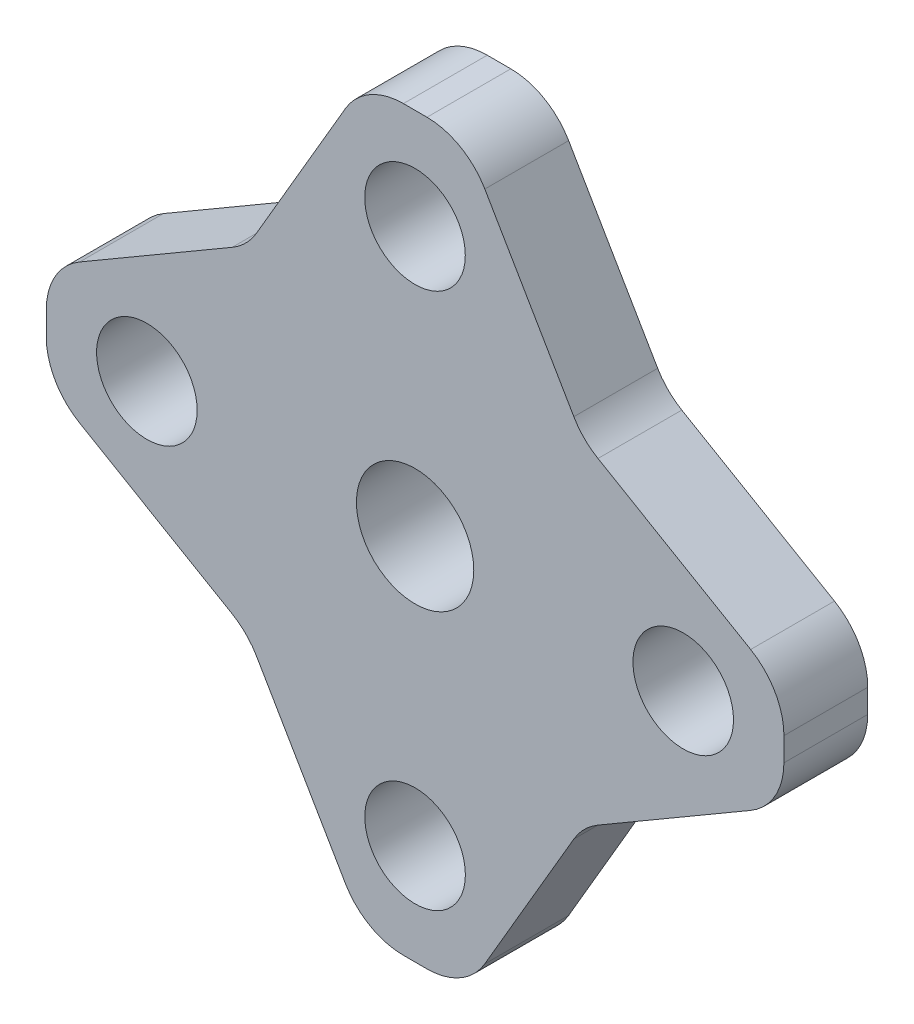
ISO-10303-21;
HEADER;
FILE_DESCRIPTION(('STEP AP214'),'2;1');
FILE_NAME('part.step','',(''),(''),'','','');
FILE_SCHEMA(('AUTOMOTIVE_DESIGN { 1 0 10303 214 1 1 1 1 }'));
ENDSEC;
DATA;
#1=APPLICATION_CONTEXT('core data for automotive mechanical design processes');
#2=APPLICATION_PROTOCOL_DEFINITION('international standard','automotive_design',2000,#1);
#3=PRODUCT_CONTEXT('',#1,'mechanical');
#4=PRODUCT('Part','Part','',(#3));
#5=PRODUCT_RELATED_PRODUCT_CATEGORY('part','',(#4));
#6=PRODUCT_DEFINITION_FORMATION('','',#4);
#7=PRODUCT_DEFINITION_CONTEXT('part definition',#1,'design');
#8=PRODUCT_DEFINITION('design','',#6,#7);
#9=PRODUCT_DEFINITION_SHAPE('','',#8);
#10=(LENGTH_UNIT() NAMED_UNIT(*) SI_UNIT(.MILLI.,.METRE.));
#11=(NAMED_UNIT(*) PLANE_ANGLE_UNIT() SI_UNIT($,.RADIAN.));
#12=(NAMED_UNIT(*) SI_UNIT($,.STERADIAN.) SOLID_ANGLE_UNIT());
#13=UNCERTAINTY_MEASURE_WITH_UNIT(LENGTH_MEASURE(1.E-05),#10,'distance_accuracy_value','');
#14=(GEOMETRIC_REPRESENTATION_CONTEXT(3) GLOBAL_UNCERTAINTY_ASSIGNED_CONTEXT((#13)) GLOBAL_UNIT_ASSIGNED_CONTEXT((#10,
#11,#12)) REPRESENTATION_CONTEXT('',''));
#15=CARTESIAN_POINT('',(0.,0.,0.));
#16=DIRECTION('',(0.,0.,1.));
#17=DIRECTION('',(1.,0.,0.));
#18=AXIS2_PLACEMENT_3D('',#15,#16,#17);
#19=CARTESIAN_POINT('',(0.,0.,2.5));
#20=DIRECTION('',(0.,0.,1.));
#21=DIRECTION('',(1.,0.,0.));
#22=AXIS2_PLACEMENT_3D('',#19,#20,#21);
#23=PLANE('',#22);
#24=CARTESIAN_POINT('',(0.,0.,2.5));
#25=DIRECTION('',(0.,0.,1.));
#26=DIRECTION('',(1.,0.,0.));
#27=AXIS2_PLACEMENT_3D('',#24,#25,#26);
#28=CIRCLE('',#27,1.75);
#29=CARTESIAN_POINT('',(1.75,0.,2.5));
#30=VERTEX_POINT('',#29);
#31=EDGE_CURVE('E862',#30,#30,#28,.T.);
#32=ORIENTED_EDGE('',*,*,#31,.F.);
#33=EDGE_LOOP('',(#32));
#34=FACE_BOUND('',#33,.T.);
#35=CARTESIAN_POINT('',(7.99719855666938,0.00280144333063154,2.5));
#36=DIRECTION('',(0.,0.,1.));
#37=DIRECTION('',(1.,0.,0.));
#38=AXIS2_PLACEMENT_3D('',#35,#36,#37);
#39=CIRCLE('',#38,1.5);
#40=CARTESIAN_POINT('',(9.49719855666938,0.00280144333063154,2.5));
#41=VERTEX_POINT('',#40);
#42=EDGE_CURVE('E249',#41,#41,#39,.T.);
#43=ORIENTED_EDGE('',*,*,#42,.F.);
#44=EDGE_LOOP('',(#43));
#45=FACE_BOUND('',#44,.T.);
#46=CARTESIAN_POINT('',(-0.00280144333062432,8.00000000000001,2.5));
#47=DIRECTION('',(0.,0.,1.));
#48=DIRECTION('',(1.,0.,0.));
#49=AXIS2_PLACEMENT_3D('',#46,#47,#48);
#50=CIRCLE('',#49,1.5);
#51=CARTESIAN_POINT('',(1.49719855666938,8.00000000000001,2.5));
#52=VERTEX_POINT('',#51);
#53=EDGE_CURVE('E396',#52,#52,#50,.T.);
#54=ORIENTED_EDGE('',*,*,#53,.F.);
#55=EDGE_LOOP('',(#54));
#56=FACE_BOUND('',#55,.T.);
#57=CARTESIAN_POINT('',(0.,-7.99719855666937,2.5));
#58=DIRECTION('',(0.,0.,1.));
#59=DIRECTION('',(1.,0.,0.));
#60=AXIS2_PLACEMENT_3D('',#57,#58,#59);
#61=CIRCLE('',#60,1.5);
#62=CARTESIAN_POINT('',(1.5,-7.99719855666937,2.5));
#63=VERTEX_POINT('',#62);
#64=EDGE_CURVE('E409',#63,#63,#61,.T.);
#65=ORIENTED_EDGE('',*,*,#64,.F.);
#66=EDGE_LOOP('',(#65));
#67=FACE_BOUND('',#66,.T.);
#68=CARTESIAN_POINT('',(-8.,0.,2.5));
#69=DIRECTION('',(0.,0.,1.));
#70=DIRECTION('',(1.,0.,0.));
#71=AXIS2_PLACEMENT_3D('',#68,#69,#70);
#72=CIRCLE('',#71,1.5);
#73=CARTESIAN_POINT('',(-6.5,0.,2.5));
#74=VERTEX_POINT('',#73);
#75=EDGE_CURVE('E250',#74,#74,#72,.T.);
#76=ORIENTED_EDGE('',*,*,#75,.F.);
#77=EDGE_LOOP('',(#76));
#78=FACE_BOUND('',#77,.T.);
#79=DIRECTION('',(-0.863829026576179,-0.503785085968661,0.));
#80=VECTOR('',#79,1.);
#81=CARTESIAN_POINT('',(-3.44491796630178,5.90692383785727,2.5));
#82=LINE('',#81,#80);
#83=CARTESIAN_POINT('',(-5.45464541311404,4.7348507962985,2.5));
#84=VERTEX_POINT('',#83);
#85=CARTESIAN_POINT('',(-10.0071324415594,2.07984037359156,2.5));
#86=VERTEX_POINT('',#85);
#87=EDGE_CURVE('E367',#84,#86,#82,.T.);
#88=ORIENTED_EDGE('',*,*,#87,.T.);
#89=CARTESIAN_POINT('',(-8.99956226962205,0.352182320439203,2.5));
#90=DIRECTION('',(0.,0.,1.));
#91=DIRECTION('',(1.,0.,0.));
#92=AXIS2_PLACEMENT_3D('',#89,#90,#91);
#93=CIRCLE('',#92,2.);
#94=CARTESIAN_POINT('',(-10.99956060508,0.354762662584683,2.5));
#95=VERTEX_POINT('',#94);
#96=EDGE_CURVE('E279',#86,#95,#93,.T.);
#97=ORIENTED_EDGE('',*,*,#96,.T.);
#98=DIRECTION('',(-0.00129017107274002,-0.999999167728955,0.));
#99=VECTOR('',#98,1.);
#100=CARTESIAN_POINT('',(-11.,0.0141918936116424,2.5));
#101=LINE('',#100,#99);
#102=CARTESIAN_POINT('',(-11.0004669380493,-0.347727289464029,2.5));
#103=VERTEX_POINT('',#102);
#104=EDGE_CURVE('E227',#95,#103,#101,.T.);
#105=ORIENTED_EDGE('',*,*,#104,.T.);
#106=CARTESIAN_POINT('',(-9.00046860259139,-0.350307631609509,2.5));
#107=DIRECTION('',(0.,0.,1.));
#108=DIRECTION('',(1.,0.,0.));
#109=AXIS2_PLACEMENT_3D('',#106,#107,#108);
#110=CIRCLE('',#109,2.);
#111=CARTESIAN_POINT('',(-10.0083852215047,-2.07776359032985,2.5));
#112=VERTEX_POINT('',#111);
#113=EDGE_CURVE('E266',#103,#112,#110,.T.);
#114=ORIENTED_EDGE('',*,*,#113,.T.);
#115=DIRECTION('',(0.863727979360172,-0.50395830945664,0.));
#116=VECTOR('',#115,1.);
#117=CARTESIAN_POINT('',(-3.44628434989573,-5.90654457319178,2.5));
#118=LINE('',#117,#116);
#119=CARTESIAN_POINT('',(-5.45459223053757,-4.73475962633102,2.5));
#120=VERTEX_POINT('',#119);
#121=EDGE_CURVE('E348',#112,#120,#118,.T.);
#122=ORIENTED_EDGE('',*,*,#121,.T.);
#123=CARTESIAN_POINT('',(-6.46250884945085,-6.46221558505137,2.5));
#124=DIRECTION('',(0.,0.,1.));
#125=DIRECTION('',(1.,0.,0.));
#126=AXIS2_PLACEMENT_3D('',#123,#124,#125);
#127=CIRCLE('',#126,2.);
#128=CARTESIAN_POINT('',(-4.73485079629849,-5.45464541311404,2.5));
#129=VERTEX_POINT('',#128);
#130=EDGE_CURVE('E52',#120,#129,#127,.F.);
#131=ORIENTED_EDGE('',*,*,#130,.T.);
#132=DIRECTION('',(0.503785085968662,-0.863829026576178,0.));
#133=VECTOR('',#132,1.);
#134=CARTESIAN_POINT('',(-5.90692383785726,-3.44491796630179,2.5));
#135=LINE('',#134,#133);
#136=CARTESIAN_POINT('',(-2.07984037359155,-10.0071324415594,2.5));
#137=VERTEX_POINT('',#136);
#138=EDGE_CURVE('E345',#129,#137,#135,.T.);
#139=ORIENTED_EDGE('',*,*,#138,.T.);
#140=CARTESIAN_POINT('',(-0.352182320439191,-8.99956226962204,2.5));
#141=DIRECTION('',(0.,0.,1.));
#142=DIRECTION('',(1.,0.,0.));
#143=AXIS2_PLACEMENT_3D('',#140,#141,#142);
#144=CIRCLE('',#143,2.);
#145=CARTESIAN_POINT('',(-0.354762662584671,-10.99956060508,2.5));
#146=VERTEX_POINT('',#145);
#147=EDGE_CURVE('E268',#137,#146,#144,.T.);
#148=ORIENTED_EDGE('',*,*,#147,.T.);
#149=DIRECTION('',(0.999999167728955,-0.00129017107274002,0.));
#150=VECTOR('',#149,1.);
#151=CARTESIAN_POINT('',(-0.0141918936116424,-11.,2.5));
#152=LINE('',#151,#150);
#153=CARTESIAN_POINT('',(0.347727289464012,-11.0004669380493,2.5));
#154=VERTEX_POINT('',#153);
#155=EDGE_CURVE('E406',#146,#154,#152,.T.);
#156=ORIENTED_EDGE('',*,*,#155,.T.);
#157=CARTESIAN_POINT('',(0.350307631609492,-9.00046860259138,2.5));
#158=DIRECTION('',(0.,0.,1.));
#159=DIRECTION('',(1.,0.,0.));
#160=AXIS2_PLACEMENT_3D('',#157,#158,#159);
#161=CIRCLE('',#160,2.);
#162=CARTESIAN_POINT('',(2.07776359032983,-10.0083852215047,2.5));
#163=VERTEX_POINT('',#162);
#164=EDGE_CURVE('E270',#154,#163,#161,.T.);
#165=ORIENTED_EDGE('',*,*,#164,.T.);
#166=DIRECTION('',(0.50395830945664,0.863727979360172,0.));
#167=VECTOR('',#166,1.);
#168=CARTESIAN_POINT('',(5.90654457319177,-3.44628434989572,2.5));
#169=LINE('',#168,#167);
#170=CARTESIAN_POINT('',(4.73475962633101,-5.45459223053756,2.5));
#171=VERTEX_POINT('',#170);
#172=EDGE_CURVE('E869',#163,#171,#169,.T.);
#173=ORIENTED_EDGE('',*,*,#172,.T.);
#174=CARTESIAN_POINT('',(6.46221558505135,-6.46250884945084,2.5));
#175=DIRECTION('',(0.,0.,1.));
#176=DIRECTION('',(1.,0.,0.));
#177=AXIS2_PLACEMENT_3D('',#174,#175,#176);
#178=CIRCLE('',#177,2.);
#179=CARTESIAN_POINT('',(5.45464541311403,-4.73485079629848,2.5));
#180=VERTEX_POINT('',#179);
#181=EDGE_CURVE('E338',#171,#180,#178,.F.);
#182=ORIENTED_EDGE('',*,*,#181,.T.);
#183=DIRECTION('',(-0.863829026576178,-0.503785085968662,0.));
#184=VECTOR('',#183,1.);
#185=CARTESIAN_POINT('',(3.44491796630178,-5.90692383785725,2.5));
#186=LINE('',#185,#184);
#187=CARTESIAN_POINT('',(10.0071324415594,-2.07984037359153,2.5));
#188=VERTEX_POINT('',#187);
#189=EDGE_CURVE('E864',#188,#180,#186,.T.);
#190=ORIENTED_EDGE('',*,*,#189,.F.);
#191=CARTESIAN_POINT('',(8.99956226962204,-0.352182320439173,2.5));
#192=DIRECTION('',(0.,0.,1.));
#193=DIRECTION('',(1.,0.,0.));
#194=AXIS2_PLACEMENT_3D('',#191,#192,#193);
#195=CIRCLE('',#194,2.);
#196=CARTESIAN_POINT('',(10.99956060508,-0.354762662584653,2.5));
#197=VERTEX_POINT('',#196);
#198=EDGE_CURVE('E272',#188,#197,#195,.T.);
#199=ORIENTED_EDGE('',*,*,#198,.T.);
#200=DIRECTION('',(-0.00129017107274002,-0.999999167728955,0.));
#201=VECTOR('',#200,1.);
#202=CARTESIAN_POINT('',(11.,-0.0141918936116424,2.5));
#203=LINE('',#202,#201);
#204=CARTESIAN_POINT('',(11.0004669380493,0.347727289464032,2.5));
#205=VERTEX_POINT('',#204);
#206=EDGE_CURVE('E399',#205,#197,#203,.T.);
#207=ORIENTED_EDGE('',*,*,#206,.F.);
#208=CARTESIAN_POINT('',(9.00046860259138,0.350307631609512,2.5));
#209=DIRECTION('',(0.,0.,1.));
#210=DIRECTION('',(1.,0.,0.));
#211=AXIS2_PLACEMENT_3D('',#208,#209,#210);
#212=CIRCLE('',#211,2.);
#213=CARTESIAN_POINT('',(10.0083852215047,2.07776359032986,2.5));
#214=VERTEX_POINT('',#213);
#215=EDGE_CURVE('E274',#205,#214,#212,.T.);
#216=ORIENTED_EDGE('',*,*,#215,.T.);
#217=DIRECTION('',(0.863727979360171,-0.503958309456641,0.));
#218=VECTOR('',#217,1.);
#219=CARTESIAN_POINT('',(3.44628434989574,5.90654457319178,2.5));
#220=LINE('',#219,#218);
#221=CARTESIAN_POINT('',(5.45459223053757,4.73475962633103,2.5));
#222=VERTEX_POINT('',#221);
#223=EDGE_CURVE('E378',#222,#214,#220,.T.);
#224=ORIENTED_EDGE('',*,*,#223,.F.);
#225=CARTESIAN_POINT('',(6.46250884945085,6.46221558505137,2.5));
#226=DIRECTION('',(0.,0.,1.));
#227=DIRECTION('',(1.,0.,0.));
#228=AXIS2_PLACEMENT_3D('',#225,#226,#227);
#229=CIRCLE('',#228,2.);
#230=CARTESIAN_POINT('',(4.73485079629849,5.45464541311404,2.5));
#231=VERTEX_POINT('',#230);
#232=EDGE_CURVE('E334',#222,#231,#229,.F.);
#233=ORIENTED_EDGE('',*,*,#232,.T.);
#234=DIRECTION('',(0.503785085968662,-0.863829026576178,0.));
#235=VECTOR('',#234,1.);
#236=CARTESIAN_POINT('',(5.90692383785726,3.44491796630179,2.5));
#237=LINE('',#236,#235);
#238=CARTESIAN_POINT('',(2.07984037359154,10.0071324415594,2.5));
#239=VERTEX_POINT('',#238);
#240=EDGE_CURVE('E381',#239,#231,#237,.T.);
#241=ORIENTED_EDGE('',*,*,#240,.F.);
#242=CARTESIAN_POINT('',(0.352182320439187,8.99956226962205,2.5));
#243=DIRECTION('',(0.,0.,1.));
#244=DIRECTION('',(1.,0.,0.));
#245=AXIS2_PLACEMENT_3D('',#242,#243,#244);
#246=CIRCLE('',#245,2.);
#247=CARTESIAN_POINT('',(0.354762662584667,10.99956060508,2.5));
#248=VERTEX_POINT('',#247);
#249=EDGE_CURVE('E276',#239,#248,#246,.T.);
#250=ORIENTED_EDGE('',*,*,#249,.T.);
#251=DIRECTION('',(0.999999167728955,-0.00129017107274002,0.));
#252=VECTOR('',#251,1.);
#253=CARTESIAN_POINT('',(0.0141918936116424,11.,2.5));
#254=LINE('',#253,#252);
#255=CARTESIAN_POINT('',(-0.347727289464043,11.0004669380493,2.5));
#256=VERTEX_POINT('',#255);
#257=EDGE_CURVE('E402',#256,#248,#254,.T.);
#258=ORIENTED_EDGE('',*,*,#257,.F.);
#259=CARTESIAN_POINT('',(-0.350307631609523,9.00046860259138,2.5));
#260=DIRECTION('',(0.,0.,1.));
#261=DIRECTION('',(1.,0.,0.));
#262=AXIS2_PLACEMENT_3D('',#259,#260,#261);
#263=CIRCLE('',#262,2.);
#264=CARTESIAN_POINT('',(-2.07776359032987,10.0083852215047,2.5));
#265=VERTEX_POINT('',#264);
#266=EDGE_CURVE('E59',#256,#265,#263,.T.);
#267=ORIENTED_EDGE('',*,*,#266,.T.);
#268=DIRECTION('',(0.503958309456639,0.863727979360173,0.));
#269=VECTOR('',#268,1.);
#270=CARTESIAN_POINT('',(-5.90654457319178,3.44628434989572,2.5));
#271=LINE('',#270,#269);
#272=CARTESIAN_POINT('',(-4.73475962633102,5.45459223053758,2.5));
#273=VERTEX_POINT('',#272);
#274=EDGE_CURVE('E369',#273,#265,#271,.T.);
#275=ORIENTED_EDGE('',*,*,#274,.F.);
#276=CARTESIAN_POINT('',(-6.46221558505136,6.46250884945085,2.5));
#277=DIRECTION('',(0.,0.,1.));
#278=DIRECTION('',(1.,0.,0.));
#279=AXIS2_PLACEMENT_3D('',#276,#277,#278);
#280=CIRCLE('',#279,2.);
#281=EDGE_CURVE('E67',#273,#84,#280,.F.);
#282=ORIENTED_EDGE('',*,*,#281,.T.);
#283=EDGE_LOOP('',(#88,#97,#105,#114,#122,#131,#139,#148,#156,#165,#173,#182,#190,#199,#207,
#216,#224,#233,#241,#250,#258,#267,#275,#282));
#284=FACE_BOUND('',#283,.T.);
#285=ADVANCED_FACE('F44',(#34,#45,#56,#67,#78,#284),#23,.T.);
#286=CARTESIAN_POINT('',(0.,0.,0.));
#287=DIRECTION('',(0.,0.,1.));
#288=DIRECTION('',(1.,0.,0.));
#289=AXIS2_PLACEMENT_3D('',#286,#287,#288);
#290=PLANE('',#289);
#291=CARTESIAN_POINT('',(0.,0.,0.));
#292=DIRECTION('',(0.,0.,1.));
#293=DIRECTION('',(1.,0.,0.));
#294=AXIS2_PLACEMENT_3D('',#291,#292,#293);
#295=CIRCLE('',#294,1.75);
#296=CARTESIAN_POINT('',(1.75,0.,0.));
#297=VERTEX_POINT('',#296);
#298=EDGE_CURVE('E860',#297,#297,#295,.T.);
#299=ORIENTED_EDGE('',*,*,#298,.T.);
#300=EDGE_LOOP('',(#299));
#301=FACE_BOUND('',#300,.T.);
#302=CARTESIAN_POINT('',(-8.,0.,0.));
#303=DIRECTION('',(0.,0.,1.));
#304=DIRECTION('',(1.,0.,0.));
#305=AXIS2_PLACEMENT_3D('',#302,#303,#304);
#306=CIRCLE('',#305,1.5);
#307=CARTESIAN_POINT('',(-6.5,0.,0.));
#308=VERTEX_POINT('',#307);
#309=EDGE_CURVE('E246',#308,#308,#306,.T.);
#310=ORIENTED_EDGE('',*,*,#309,.T.);
#311=EDGE_LOOP('',(#310));
#312=FACE_BOUND('',#311,.T.);
#313=CARTESIAN_POINT('',(0.,-7.99719855666937,0.));
#314=DIRECTION('',(0.,0.,1.));
#315=DIRECTION('',(1.,0.,0.));
#316=AXIS2_PLACEMENT_3D('',#313,#314,#315);
#317=CIRCLE('',#316,1.5);
#318=CARTESIAN_POINT('',(1.5,-7.99719855666937,0.));
#319=VERTEX_POINT('',#318);
#320=EDGE_CURVE('E237',#319,#319,#317,.T.);
#321=ORIENTED_EDGE('',*,*,#320,.T.);
#322=EDGE_LOOP('',(#321));
#323=FACE_BOUND('',#322,.T.);
#324=CARTESIAN_POINT('',(-0.00280144333062432,8.00000000000001,0.));
#325=DIRECTION('',(0.,0.,1.));
#326=DIRECTION('',(1.,0.,0.));
#327=AXIS2_PLACEMENT_3D('',#324,#325,#326);
#328=CIRCLE('',#327,1.5);
#329=CARTESIAN_POINT('',(1.49719855666938,8.00000000000001,0.));
#330=VERTEX_POINT('',#329);
#331=EDGE_CURVE('E416',#330,#330,#328,.T.);
#332=ORIENTED_EDGE('',*,*,#331,.T.);
#333=EDGE_LOOP('',(#332));
#334=FACE_BOUND('',#333,.T.);
#335=CARTESIAN_POINT('',(7.99719855666938,0.00280144333063154,0.));
#336=DIRECTION('',(0.,0.,1.));
#337=DIRECTION('',(1.,0.,0.));
#338=AXIS2_PLACEMENT_3D('',#335,#336,#337);
#339=CIRCLE('',#338,1.5);
#340=CARTESIAN_POINT('',(9.49719855666938,0.00280144333063154,0.));
#341=VERTEX_POINT('',#340);
#342=EDGE_CURVE('E391',#341,#341,#339,.T.);
#343=ORIENTED_EDGE('',*,*,#342,.T.);
#344=EDGE_LOOP('',(#343));
#345=FACE_BOUND('',#344,.T.);
#346=DIRECTION('',(-0.00129017107274002,-0.999999167728955,0.));
#347=VECTOR('',#346,1.);
#348=CARTESIAN_POINT('',(-11.,0.0141918936116424,0.));
#349=LINE('',#348,#347);
#350=CARTESIAN_POINT('',(-10.99956060508,0.354762662584683,0.));
#351=VERTEX_POINT('',#350);
#352=CARTESIAN_POINT('',(-11.0004669380493,-0.347727289464029,0.));
#353=VERTEX_POINT('',#352);
#354=EDGE_CURVE('E224',#351,#353,#349,.T.);
#355=ORIENTED_EDGE('',*,*,#354,.F.);
#356=CARTESIAN_POINT('',(-8.99956226962205,0.352182320439203,0.));
#357=DIRECTION('',(0.,0.,1.));
#358=DIRECTION('',(1.,0.,0.));
#359=AXIS2_PLACEMENT_3D('',#356,#357,#358);
#360=CIRCLE('',#359,2.);
#361=CARTESIAN_POINT('',(-10.0071324415594,2.07984037359156,0.));
#362=VERTEX_POINT('',#361);
#363=EDGE_CURVE('E207',#351,#362,#360,.F.);
#364=ORIENTED_EDGE('',*,*,#363,.T.);
#365=DIRECTION('',(-0.863829026576179,-0.503785085968661,0.));
#366=VECTOR('',#365,1.);
#367=CARTESIAN_POINT('',(-3.44491796630178,5.90692383785727,0.));
#368=LINE('',#367,#366);
#369=CARTESIAN_POINT('',(-5.45464541311404,4.7348507962985,0.));
#370=VERTEX_POINT('',#369);
#371=EDGE_CURVE('E387',#370,#362,#368,.T.);
#372=ORIENTED_EDGE('',*,*,#371,.F.);
#373=CARTESIAN_POINT('',(-6.46221558505136,6.46250884945085,0.));
#374=DIRECTION('',(0.,0.,1.));
#375=DIRECTION('',(1.,0.,0.));
#376=AXIS2_PLACEMENT_3D('',#373,#374,#375);
#377=CIRCLE('',#376,2.);
#378=CARTESIAN_POINT('',(-4.73475962633102,5.45459223053758,0.));
#379=VERTEX_POINT('',#378);
#380=EDGE_CURVE('E332',#370,#379,#377,.T.);
#381=ORIENTED_EDGE('',*,*,#380,.T.);
#382=DIRECTION('',(0.503958309456639,0.863727979360173,0.));
#383=VECTOR('',#382,1.);
#384=CARTESIAN_POINT('',(-5.90654457319178,3.44628434989572,0.));
#385=LINE('',#384,#383);
#386=CARTESIAN_POINT('',(-2.07776359032987,10.0083852215047,0.));
#387=VERTEX_POINT('',#386);
#388=EDGE_CURVE('E389',#379,#387,#385,.T.);
#389=ORIENTED_EDGE('',*,*,#388,.T.);
#390=CARTESIAN_POINT('',(-0.350307631609523,9.00046860259138,0.));
#391=DIRECTION('',(0.,0.,1.));
#392=DIRECTION('',(1.,0.,0.));
#393=AXIS2_PLACEMENT_3D('',#390,#391,#392);
#394=CIRCLE('',#393,2.);
#395=CARTESIAN_POINT('',(-0.347727289464043,11.0004669380493,0.));
#396=VERTEX_POINT('',#395);
#397=EDGE_CURVE('E218',#387,#396,#394,.F.);
#398=ORIENTED_EDGE('',*,*,#397,.T.);
#399=DIRECTION('',(0.999999167728955,-0.00129017107274002,0.));
#400=VECTOR('',#399,1.);
#401=CARTESIAN_POINT('',(0.0141918936116424,11.,0.));
#402=LINE('',#401,#400);
#403=CARTESIAN_POINT('',(0.354762662584667,10.99956060508,0.));
#404=VERTEX_POINT('',#403);
#405=EDGE_CURVE('E234',#396,#404,#402,.T.);
#406=ORIENTED_EDGE('',*,*,#405,.T.);
#407=CARTESIAN_POINT('',(0.352182320439187,8.99956226962205,0.));
#408=DIRECTION('',(0.,0.,1.));
#409=DIRECTION('',(1.,0.,0.));
#410=AXIS2_PLACEMENT_3D('',#407,#408,#409);
#411=CIRCLE('',#410,2.);
#412=CARTESIAN_POINT('',(2.07984037359154,10.0071324415594,0.));
#413=VERTEX_POINT('',#412);
#414=EDGE_CURVE('E261',#404,#413,#411,.F.);
#415=ORIENTED_EDGE('',*,*,#414,.T.);
#416=DIRECTION('',(0.503785085968662,-0.863829026576178,0.));
#417=VECTOR('',#416,1.);
#418=CARTESIAN_POINT('',(5.90692383785726,3.44491796630179,0.));
#419=LINE('',#418,#417);
#420=CARTESIAN_POINT('',(4.73485079629849,5.45464541311404,0.));
#421=VERTEX_POINT('',#420);
#422=EDGE_CURVE('E375',#413,#421,#419,.T.);
#423=ORIENTED_EDGE('',*,*,#422,.T.);
#424=CARTESIAN_POINT('',(6.46250884945085,6.46221558505137,0.));
#425=DIRECTION('',(0.,0.,1.));
#426=DIRECTION('',(1.,0.,0.));
#427=AXIS2_PLACEMENT_3D('',#424,#425,#426);
#428=CIRCLE('',#427,2.);
#429=CARTESIAN_POINT('',(5.45459223053757,4.73475962633103,0.));
#430=VERTEX_POINT('',#429);
#431=EDGE_CURVE('E336',#421,#430,#428,.T.);
#432=ORIENTED_EDGE('',*,*,#431,.T.);
#433=DIRECTION('',(0.863727979360171,-0.503958309456641,0.));
#434=VECTOR('',#433,1.);
#435=CARTESIAN_POINT('',(3.44628434989574,5.90654457319178,0.));
#436=LINE('',#435,#434);
#437=CARTESIAN_POINT('',(10.0083852215047,2.07776359032986,0.));
#438=VERTEX_POINT('',#437);
#439=EDGE_CURVE('E357',#430,#438,#436,.T.);
#440=ORIENTED_EDGE('',*,*,#439,.T.);
#441=CARTESIAN_POINT('',(9.00046860259138,0.350307631609512,0.));
#442=DIRECTION('',(0.,0.,1.));
#443=DIRECTION('',(1.,0.,0.));
#444=AXIS2_PLACEMENT_3D('',#441,#442,#443);
#445=CIRCLE('',#444,2.);
#446=CARTESIAN_POINT('',(11.0004669380493,0.347727289464032,0.));
#447=VERTEX_POINT('',#446);
#448=EDGE_CURVE('E259',#438,#447,#445,.F.);
#449=ORIENTED_EDGE('',*,*,#448,.T.);
#450=DIRECTION('',(-0.00129017107274002,-0.999999167728955,0.));
#451=VECTOR('',#450,1.);
#452=CARTESIAN_POINT('',(11.,-0.0141918936116424,0.));
#453=LINE('',#452,#451);
#454=CARTESIAN_POINT('',(10.99956060508,-0.354762662584653,0.));
#455=VERTEX_POINT('',#454);
#456=EDGE_CURVE('E240',#447,#455,#453,.T.);
#457=ORIENTED_EDGE('',*,*,#456,.T.);
#458=CARTESIAN_POINT('',(8.99956226962204,-0.352182320439173,0.));
#459=DIRECTION('',(0.,0.,1.));
#460=DIRECTION('',(1.,0.,0.));
#461=AXIS2_PLACEMENT_3D('',#458,#459,#460);
#462=CIRCLE('',#461,2.);
#463=CARTESIAN_POINT('',(10.0071324415594,-2.07984037359153,0.));
#464=VERTEX_POINT('',#463);
#465=EDGE_CURVE('E257',#455,#464,#462,.F.);
#466=ORIENTED_EDGE('',*,*,#465,.T.);
#467=DIRECTION('',(-0.863829026576178,-0.503785085968662,0.));
#468=VECTOR('',#467,1.);
#469=CARTESIAN_POINT('',(3.44491796630178,-5.90692383785725,0.));
#470=LINE('',#469,#468);
#471=CARTESIAN_POINT('',(5.45464541311403,-4.73485079629848,0.));
#472=VERTEX_POINT('',#471);
#473=EDGE_CURVE('E867',#464,#472,#470,.T.);
#474=ORIENTED_EDGE('',*,*,#473,.T.);
#475=CARTESIAN_POINT('',(6.46221558505135,-6.46250884945084,0.));
#476=DIRECTION('',(0.,0.,1.));
#477=DIRECTION('',(1.,0.,0.));
#478=AXIS2_PLACEMENT_3D('',#475,#476,#477);
#479=CIRCLE('',#478,2.);
#480=CARTESIAN_POINT('',(4.73475962633101,-5.45459223053756,0.));
#481=VERTEX_POINT('',#480);
#482=EDGE_CURVE('E340',#472,#481,#479,.T.);
#483=ORIENTED_EDGE('',*,*,#482,.T.);
#484=DIRECTION('',(0.50395830945664,0.863727979360172,0.));
#485=VECTOR('',#484,1.);
#486=CARTESIAN_POINT('',(5.90654457319177,-3.44628434989572,0.));
#487=LINE('',#486,#485);
#488=CARTESIAN_POINT('',(2.07776359032983,-10.0083852215047,0.));
#489=VERTEX_POINT('',#488);
#490=EDGE_CURVE('E384',#489,#481,#487,.T.);
#491=ORIENTED_EDGE('',*,*,#490,.F.);
#492=CARTESIAN_POINT('',(0.350307631609492,-9.00046860259138,0.));
#493=DIRECTION('',(0.,0.,1.));
#494=DIRECTION('',(1.,0.,0.));
#495=AXIS2_PLACEMENT_3D('',#492,#493,#494);
#496=CIRCLE('',#495,2.);
#497=CARTESIAN_POINT('',(0.347727289464012,-11.0004669380493,0.));
#498=VERTEX_POINT('',#497);
#499=EDGE_CURVE('E255',#489,#498,#496,.F.);
#500=ORIENTED_EDGE('',*,*,#499,.T.);
#501=DIRECTION('',(0.999999167728955,-0.00129017107274002,0.));
#502=VECTOR('',#501,1.);
#503=CARTESIAN_POINT('',(-0.0141918936116424,-11.,0.));
#504=LINE('',#503,#502);
#505=CARTESIAN_POINT('',(-0.354762662584671,-10.99956060508,0.));
#506=VERTEX_POINT('',#505);
#507=EDGE_CURVE('E233',#506,#498,#504,.T.);
#508=ORIENTED_EDGE('',*,*,#507,.F.);
#509=CARTESIAN_POINT('',(-0.352182320439191,-8.99956226962204,0.));
#510=DIRECTION('',(0.,0.,1.));
#511=DIRECTION('',(1.,0.,0.));
#512=AXIS2_PLACEMENT_3D('',#509,#510,#511);
#513=CIRCLE('',#512,2.);
#514=CARTESIAN_POINT('',(-2.07984037359155,-10.0071324415594,0.));
#515=VERTEX_POINT('',#514);
#516=EDGE_CURVE('E253',#506,#515,#513,.F.);
#517=ORIENTED_EDGE('',*,*,#516,.T.);
#518=DIRECTION('',(0.503785085968662,-0.863829026576178,0.));
#519=VECTOR('',#518,1.);
#520=CARTESIAN_POINT('',(-5.90692383785726,-3.44491796630179,0.));
#521=LINE('',#520,#519);
#522=CARTESIAN_POINT('',(-4.73485079629849,-5.45464541311404,0.));
#523=VERTEX_POINT('',#522);
#524=EDGE_CURVE('E363',#523,#515,#521,.T.);
#525=ORIENTED_EDGE('',*,*,#524,.F.);
#526=CARTESIAN_POINT('',(-6.46250884945085,-6.46221558505137,0.));
#527=DIRECTION('',(0.,0.,1.));
#528=DIRECTION('',(1.,0.,0.));
#529=AXIS2_PLACEMENT_3D('',#526,#527,#528);
#530=CIRCLE('',#529,2.);
#531=CARTESIAN_POINT('',(-5.45459223053757,-4.73475962633102,0.));
#532=VERTEX_POINT('',#531);
#533=EDGE_CURVE('E11',#523,#532,#530,.T.);
#534=ORIENTED_EDGE('',*,*,#533,.T.);
#535=DIRECTION('',(0.863727979360172,-0.50395830945664,0.));
#536=VECTOR('',#535,1.);
#537=CARTESIAN_POINT('',(-3.44628434989573,-5.90654457319178,0.));
#538=LINE('',#537,#536);
#539=CARTESIAN_POINT('',(-10.0083852215047,-2.07776359032985,0.));
#540=VERTEX_POINT('',#539);
#541=EDGE_CURVE('E362',#540,#532,#538,.T.);
#542=ORIENTED_EDGE('',*,*,#541,.F.);
#543=CARTESIAN_POINT('',(-9.00046860259139,-0.350307631609509,0.));
#544=DIRECTION('',(0.,0.,1.));
#545=DIRECTION('',(1.,0.,0.));
#546=AXIS2_PLACEMENT_3D('',#543,#544,#545);
#547=CIRCLE('',#546,2.);
#548=EDGE_CURVE('E228',#540,#353,#547,.F.);
#549=ORIENTED_EDGE('',*,*,#548,.T.);
#550=EDGE_LOOP('',(#355,#364,#372,#381,#389,#398,#406,#415,#423,#432,#440,#449,#457,#466,#474,
#483,#491,#500,#508,#517,#525,#534,#542,#549));
#551=FACE_BOUND('',#550,.T.);
#552=ADVANCED_FACE('F231',(#301,#312,#323,#334,#345,#551),#290,.F.);
#553=CARTESIAN_POINT('',(11.,-0.0141918936116424,2.5));
#554=DIRECTION('',(0.999999167728955,-0.00129017107274002,0.));
#555=DIRECTION('',(0.00129017107274002,0.999999167728955,0.));
#556=AXIS2_PLACEMENT_3D('',#553,#554,#555);
#557=PLANE('',#556);
#558=ORIENTED_EDGE('',*,*,#456,.F.);
#559=DIRECTION('',(0.,0.,-1.));
#560=VECTOR('',#559,1.);
#561=CARTESIAN_POINT('',(11.0004669380493,0.347727289464032,2.5));
#562=LINE('',#561,#560);
#563=EDGE_CURVE('E304',#447,#205,#562,.F.);
#564=ORIENTED_EDGE('',*,*,#563,.T.);
#565=ORIENTED_EDGE('',*,*,#206,.T.);
#566=DIRECTION('',(0.,0.,-1.));
#567=VECTOR('',#566,1.);
#568=CARTESIAN_POINT('',(10.99956060508,-0.354762662584653,0.));
#569=LINE('',#568,#567);
#570=EDGE_CURVE('E301',#197,#455,#569,.T.);
#571=ORIENTED_EDGE('',*,*,#570,.T.);
#572=EDGE_LOOP('',(#558,#564,#565,#571));
#573=FACE_BOUND('',#572,.T.);
#574=ADVANCED_FACE('F424',(#573),#557,.T.);
#575=CARTESIAN_POINT('',(0.0141918936116424,11.,2.5));
#576=DIRECTION('',(0.00129017107274002,0.999999167728955,0.));
#577=DIRECTION('',(-0.999999167728955,0.00129017107274002,0.));
#578=AXIS2_PLACEMENT_3D('',#575,#576,#577);
#579=PLANE('',#578);
#580=ORIENTED_EDGE('',*,*,#405,.F.);
#581=DIRECTION('',(0.,0.,-1.));
#582=VECTOR('',#581,1.);
#583=CARTESIAN_POINT('',(-0.347727289464043,11.0004669380493,2.5));
#584=LINE('',#583,#582);
#585=EDGE_CURVE('E289',#396,#256,#584,.F.);
#586=ORIENTED_EDGE('',*,*,#585,.T.);
#587=ORIENTED_EDGE('',*,*,#257,.T.);
#588=DIRECTION('',(0.,0.,-1.));
#589=VECTOR('',#588,1.);
#590=CARTESIAN_POINT('',(0.354762662584667,10.99956060508,0.));
#591=LINE('',#590,#589);
#592=EDGE_CURVE('E286',#248,#404,#591,.T.);
#593=ORIENTED_EDGE('',*,*,#592,.T.);
#594=EDGE_LOOP('',(#580,#586,#587,#593));
#595=FACE_BOUND('',#594,.T.);
#596=ADVANCED_FACE('F451',(#595),#579,.T.);
#597=CARTESIAN_POINT('',(-11.,0.0141918936116424,2.5));
#598=DIRECTION('',(0.999999167728955,-0.00129017107274002,0.));
#599=DIRECTION('',(0.00129017107274002,0.999999167728955,0.));
#600=AXIS2_PLACEMENT_3D('',#597,#598,#599);
#601=PLANE('',#600);
#602=ORIENTED_EDGE('',*,*,#104,.F.);
#603=DIRECTION('',(0.,0.,-1.));
#604=VECTOR('',#603,1.);
#605=CARTESIAN_POINT('',(-10.99956060508,0.354762662584683,0.));
#606=LINE('',#605,#604);
#607=EDGE_CURVE('E211',#95,#351,#606,.T.);
#608=ORIENTED_EDGE('',*,*,#607,.T.);
#609=ORIENTED_EDGE('',*,*,#354,.T.);
#610=DIRECTION('',(0.,0.,-1.));
#611=VECTOR('',#610,1.);
#612=CARTESIAN_POINT('',(-11.0004669380493,-0.347727289464029,2.5));
#613=LINE('',#612,#611);
#614=EDGE_CURVE('E229',#353,#103,#613,.F.);
#615=ORIENTED_EDGE('',*,*,#614,.T.);
#616=EDGE_LOOP('',(#602,#608,#609,#615));
#617=FACE_BOUND('',#616,.T.);
#618=ADVANCED_FACE('F223',(#617),#601,.F.);
#619=CARTESIAN_POINT('',(0.,-7.99719855666937,2.5));
#620=DIRECTION('',(0.,0.,-1.));
#621=DIRECTION('',(-1.,0.,0.));
#622=AXIS2_PLACEMENT_3D('',#619,#620,#621);
#623=CYLINDRICAL_SURFACE('',#622,1.5);
#624=ORIENTED_EDGE('',*,*,#64,.T.);
#625=EDGE_LOOP('',(#624));
#626=FACE_BOUND('',#625,.T.);
#627=ORIENTED_EDGE('',*,*,#320,.F.);
#628=EDGE_LOOP('',(#627));
#629=FACE_BOUND('',#628,.T.);
#630=ADVANCED_FACE('F487',(#626,#629),#623,.F.);
#631=CARTESIAN_POINT('',(-0.0141918936116424,-11.,2.5));
#632=DIRECTION('',(0.00129017107274002,0.999999167728955,0.));
#633=DIRECTION('',(-0.999999167728955,0.00129017107274002,0.));
#634=AXIS2_PLACEMENT_3D('',#631,#632,#633);
#635=PLANE('',#634);
#636=ORIENTED_EDGE('',*,*,#507,.T.);
#637=DIRECTION('',(0.,0.,-1.));
#638=VECTOR('',#637,1.);
#639=CARTESIAN_POINT('',(0.347727289464012,-11.0004669380493,2.5));
#640=LINE('',#639,#638);
#641=EDGE_CURVE('E319',#498,#154,#640,.F.);
#642=ORIENTED_EDGE('',*,*,#641,.T.);
#643=ORIENTED_EDGE('',*,*,#155,.F.);
#644=DIRECTION('',(0.,0.,-1.));
#645=VECTOR('',#644,1.);
#646=CARTESIAN_POINT('',(-0.354762662584671,-10.99956060508,0.));
#647=LINE('',#646,#645);
#648=EDGE_CURVE('E316',#146,#506,#647,.T.);
#649=ORIENTED_EDGE('',*,*,#648,.T.);
#650=EDGE_LOOP('',(#636,#642,#643,#649));
#651=FACE_BOUND('',#650,.T.);
#652=ADVANCED_FACE('F490',(#651),#635,.F.);
#653=CARTESIAN_POINT('',(-0.00280144333062432,8.00000000000001,2.5));
#654=DIRECTION('',(0.,0.,-1.));
#655=DIRECTION('',(-1.,0.,0.));
#656=AXIS2_PLACEMENT_3D('',#653,#654,#655);
#657=CYLINDRICAL_SURFACE('',#656,1.5);
#658=ORIENTED_EDGE('',*,*,#53,.T.);
#659=EDGE_LOOP('',(#658));
#660=FACE_BOUND('',#659,.T.);
#661=ORIENTED_EDGE('',*,*,#331,.F.);
#662=EDGE_LOOP('',(#661));
#663=FACE_BOUND('',#662,.T.);
#664=ADVANCED_FACE('F494',(#660,#663),#657,.F.);
#665=CARTESIAN_POINT('',(7.99719855666938,0.00280144333063154,2.5));
#666=DIRECTION('',(0.,0.,-1.));
#667=DIRECTION('',(-1.,0.,0.));
#668=AXIS2_PLACEMENT_3D('',#665,#666,#667);
#669=CYLINDRICAL_SURFACE('',#668,1.5);
#670=ORIENTED_EDGE('',*,*,#42,.T.);
#671=EDGE_LOOP('',(#670));
#672=FACE_BOUND('',#671,.T.);
#673=ORIENTED_EDGE('',*,*,#342,.F.);
#674=EDGE_LOOP('',(#673));
#675=FACE_BOUND('',#674,.T.);
#676=ADVANCED_FACE('F473',(#672,#675),#669,.F.);
#677=CARTESIAN_POINT('',(-8.,0.,2.5));
#678=DIRECTION('',(0.,0.,-1.));
#679=DIRECTION('',(-1.,0.,0.));
#680=AXIS2_PLACEMENT_3D('',#677,#678,#679);
#681=CYLINDRICAL_SURFACE('',#680,1.5);
#682=ORIENTED_EDGE('',*,*,#75,.T.);
#683=EDGE_LOOP('',(#682));
#684=FACE_BOUND('',#683,.T.);
#685=ORIENTED_EDGE('',*,*,#309,.F.);
#686=EDGE_LOOP('',(#685));
#687=FACE_BOUND('',#686,.T.);
#688=ADVANCED_FACE('F465',(#684,#687),#681,.F.);
#689=CARTESIAN_POINT('',(-3.44491796630178,5.90692383785727,0.));
#690=DIRECTION('',(-0.503785085968661,0.863829026576179,0.));
#691=DIRECTION('',(-0.863829026576179,-0.503785085968661,0.));
#692=AXIS2_PLACEMENT_3D('',#689,#690,#691);
#693=PLANE('',#692);
#694=ORIENTED_EDGE('',*,*,#371,.T.);
#695=DIRECTION('',(0.,0.,-1.));
#696=VECTOR('',#695,1.);
#697=CARTESIAN_POINT('',(-10.0071324415594,2.07984037359156,2.5));
#698=LINE('',#697,#696);
#699=EDGE_CURVE('E212',#362,#86,#698,.F.);
#700=ORIENTED_EDGE('',*,*,#699,.T.);
#701=ORIENTED_EDGE('',*,*,#87,.F.);
#702=DIRECTION('',(0.,0.,1.));
#703=VECTOR('',#702,1.);
#704=CARTESIAN_POINT('',(-5.45464541311404,4.7348507962985,0.));
#705=LINE('',#704,#703);
#706=EDGE_CURVE('E217',#84,#370,#705,.F.);
#707=ORIENTED_EDGE('',*,*,#706,.T.);
#708=EDGE_LOOP('',(#694,#700,#701,#707));
#709=FACE_BOUND('',#708,.T.);
#710=ADVANCED_FACE('F463',(#709),#693,.T.);
#711=CARTESIAN_POINT('',(-5.90654457319178,3.44628434989572,0.));
#712=DIRECTION('',(0.863727979360173,-0.503958309456639,0.));
#713=DIRECTION('',(0.503958309456639,0.863727979360173,0.));
#714=AXIS2_PLACEMENT_3D('',#711,#712,#713);
#715=PLANE('',#714);
#716=ORIENTED_EDGE('',*,*,#388,.F.);
#717=DIRECTION('',(0.,0.,1.));
#718=VECTOR('',#717,1.);
#719=CARTESIAN_POINT('',(-4.73475962633102,5.45459223053758,0.));
#720=LINE('',#719,#718);
#721=EDGE_CURVE('E284',#379,#273,#720,.T.);
#722=ORIENTED_EDGE('',*,*,#721,.T.);
#723=ORIENTED_EDGE('',*,*,#274,.T.);
#724=DIRECTION('',(0.,0.,-1.));
#725=VECTOR('',#724,1.);
#726=CARTESIAN_POINT('',(-2.07776359032987,10.0083852215047,0.));
#727=LINE('',#726,#725);
#728=EDGE_CURVE('E281',#265,#387,#727,.T.);
#729=ORIENTED_EDGE('',*,*,#728,.T.);
#730=EDGE_LOOP('',(#716,#722,#723,#729));
#731=FACE_BOUND('',#730,.T.);
#732=ADVANCED_FACE('F458',(#731),#715,.F.);
#733=CARTESIAN_POINT('',(5.90654457319177,-3.44628434989572,0.));
#734=DIRECTION('',(0.863727979360172,-0.50395830945664,0.));
#735=DIRECTION('',(0.50395830945664,0.863727979360172,0.));
#736=AXIS2_PLACEMENT_3D('',#733,#734,#735);
#737=PLANE('',#736);
#738=ORIENTED_EDGE('',*,*,#490,.T.);
#739=DIRECTION('',(0.,0.,1.));
#740=VECTOR('',#739,1.);
#741=CARTESIAN_POINT('',(4.73475962633101,-5.45459223053756,0.));
#742=LINE('',#741,#740);
#743=EDGE_CURVE('E313',#481,#171,#742,.T.);
#744=ORIENTED_EDGE('',*,*,#743,.T.);
#745=ORIENTED_EDGE('',*,*,#172,.F.);
#746=DIRECTION('',(0.,0.,-1.));
#747=VECTOR('',#746,1.);
#748=CARTESIAN_POINT('',(2.07776359032984,-10.0083852215047,0.));
#749=LINE('',#748,#747);
#750=EDGE_CURVE('E310',#163,#489,#749,.T.);
#751=ORIENTED_EDGE('',*,*,#750,.T.);
#752=EDGE_LOOP('',(#738,#744,#745,#751));
#753=FACE_BOUND('',#752,.T.);
#754=ADVANCED_FACE('F471',(#753),#737,.T.);
#755=CARTESIAN_POINT('',(3.44491796630178,-5.90692383785725,0.));
#756=DIRECTION('',(-0.503785085968662,0.863829026576178,0.));
#757=DIRECTION('',(-0.863829026576178,-0.503785085968662,0.));
#758=AXIS2_PLACEMENT_3D('',#755,#756,#757);
#759=PLANE('',#758);
#760=ORIENTED_EDGE('',*,*,#473,.F.);
#761=DIRECTION('',(0.,0.,-1.));
#762=VECTOR('',#761,1.);
#763=CARTESIAN_POINT('',(10.0071324415594,-2.07984037359153,2.5));
#764=LINE('',#763,#762);
#765=EDGE_CURVE('E308',#464,#188,#764,.F.);
#766=ORIENTED_EDGE('',*,*,#765,.T.);
#767=ORIENTED_EDGE('',*,*,#189,.T.);
#768=DIRECTION('',(0.,0.,1.));
#769=VECTOR('',#768,1.);
#770=CARTESIAN_POINT('',(5.45464541311403,-4.73485079629848,0.));
#771=LINE('',#770,#769);
#772=EDGE_CURVE('E306',#180,#472,#771,.F.);
#773=ORIENTED_EDGE('',*,*,#772,.T.);
#774=EDGE_LOOP('',(#760,#766,#767,#773));
#775=FACE_BOUND('',#774,.T.);
#776=ADVANCED_FACE('F658',(#775),#759,.F.);
#777=CARTESIAN_POINT('',(5.90692383785726,3.44491796630179,0.));
#778=DIRECTION('',(-0.863829026576178,-0.503785085968662,0.));
#779=DIRECTION('',(0.503785085968662,-0.863829026576178,0.));
#780=AXIS2_PLACEMENT_3D('',#777,#778,#779);
#781=PLANE('',#780);
#782=ORIENTED_EDGE('',*,*,#422,.F.);
#783=DIRECTION('',(0.,0.,-1.));
#784=VECTOR('',#783,1.);
#785=CARTESIAN_POINT('',(2.07984037359154,10.0071324415594,2.5));
#786=LINE('',#785,#784);
#787=EDGE_CURVE('E293',#413,#239,#786,.F.);
#788=ORIENTED_EDGE('',*,*,#787,.T.);
#789=ORIENTED_EDGE('',*,*,#240,.T.);
#790=DIRECTION('',(0.,0.,1.));
#791=VECTOR('',#790,1.);
#792=CARTESIAN_POINT('',(4.73485079629849,5.45464541311404,0.));
#793=LINE('',#792,#791);
#794=EDGE_CURVE('E291',#231,#421,#793,.F.);
#795=ORIENTED_EDGE('',*,*,#794,.T.);
#796=EDGE_LOOP('',(#782,#788,#789,#795));
#797=FACE_BOUND('',#796,.T.);
#798=ADVANCED_FACE('F444',(#797),#781,.F.);
#799=CARTESIAN_POINT('',(3.44628434989574,5.90654457319178,0.));
#800=DIRECTION('',(-0.503958309456641,-0.863727979360172,0.));
#801=DIRECTION('',(0.863727979360172,-0.503958309456641,0.));
#802=AXIS2_PLACEMENT_3D('',#799,#800,#801);
#803=PLANE('',#802);
#804=ORIENTED_EDGE('',*,*,#439,.F.);
#805=DIRECTION('',(0.,0.,1.));
#806=VECTOR('',#805,1.);
#807=CARTESIAN_POINT('',(5.45459223053757,4.73475962633103,2.5));
#808=LINE('',#807,#806);
#809=EDGE_CURVE('E298',#430,#222,#808,.T.);
#810=ORIENTED_EDGE('',*,*,#809,.T.);
#811=ORIENTED_EDGE('',*,*,#223,.T.);
#812=DIRECTION('',(0.,0.,-1.));
#813=VECTOR('',#812,1.);
#814=CARTESIAN_POINT('',(10.0083852215047,2.07776359032986,0.));
#815=LINE('',#814,#813);
#816=EDGE_CURVE('E295',#214,#438,#815,.T.);
#817=ORIENTED_EDGE('',*,*,#816,.T.);
#818=EDGE_LOOP('',(#804,#810,#811,#817));
#819=FACE_BOUND('',#818,.T.);
#820=ADVANCED_FACE('F434',(#819),#803,.F.);
#821=CARTESIAN_POINT('',(-5.90692383785726,-3.44491796630179,0.));
#822=DIRECTION('',(-0.863829026576178,-0.503785085968662,0.));
#823=DIRECTION('',(0.503785085968662,-0.863829026576178,0.));
#824=AXIS2_PLACEMENT_3D('',#821,#822,#823);
#825=PLANE('',#824);
#826=ORIENTED_EDGE('',*,*,#524,.T.);
#827=DIRECTION('',(0.,0.,-1.));
#828=VECTOR('',#827,1.);
#829=CARTESIAN_POINT('',(-2.07984037359155,-10.0071324415594,2.5));
#830=LINE('',#829,#828);
#831=EDGE_CURVE('E323',#515,#137,#830,.F.);
#832=ORIENTED_EDGE('',*,*,#831,.T.);
#833=ORIENTED_EDGE('',*,*,#138,.F.);
#834=DIRECTION('',(0.,0.,1.));
#835=VECTOR('',#834,1.);
#836=CARTESIAN_POINT('',(-4.73485079629849,-5.45464541311404,0.));
#837=LINE('',#836,#835);
#838=EDGE_CURVE('E321',#129,#523,#837,.F.);
#839=ORIENTED_EDGE('',*,*,#838,.T.);
#840=EDGE_LOOP('',(#826,#832,#833,#839));
#841=FACE_BOUND('',#840,.T.);
#842=ADVANCED_FACE('F354',(#841),#825,.T.);
#843=CARTESIAN_POINT('',(-3.44628434989573,-5.90654457319178,0.));
#844=DIRECTION('',(-0.50395830945664,-0.863727979360172,0.));
#845=DIRECTION('',(0.863727979360172,-0.50395830945664,0.));
#846=AXIS2_PLACEMENT_3D('',#843,#844,#845);
#847=PLANE('',#846);
#848=ORIENTED_EDGE('',*,*,#541,.T.);
#849=DIRECTION('',(0.,0.,1.));
#850=VECTOR('',#849,1.);
#851=CARTESIAN_POINT('',(-5.45459223053757,-4.73475962633102,2.5));
#852=LINE('',#851,#850);
#853=EDGE_CURVE('E328',#532,#120,#852,.T.);
#854=ORIENTED_EDGE('',*,*,#853,.T.);
#855=ORIENTED_EDGE('',*,*,#121,.F.);
#856=DIRECTION('',(0.,0.,-1.));
#857=VECTOR('',#856,1.);
#858=CARTESIAN_POINT('',(-10.0083852215047,-2.07776359032985,0.));
#859=LINE('',#858,#857);
#860=EDGE_CURVE('E325',#112,#540,#859,.T.);
#861=ORIENTED_EDGE('',*,*,#860,.T.);
#862=EDGE_LOOP('',(#848,#854,#855,#861));
#863=FACE_BOUND('',#862,.T.);
#864=ADVANCED_FACE('F365',(#863),#847,.T.);
#865=CARTESIAN_POINT('',(0.,0.,0.));
#866=DIRECTION('',(0.,0.,1.));
#867=DIRECTION('',(1.,0.,0.));
#868=AXIS2_PLACEMENT_3D('',#865,#866,#867);
#869=CYLINDRICAL_SURFACE('',#868,1.75);
#870=ORIENTED_EDGE('',*,*,#298,.F.);
#871=EDGE_LOOP('',(#870));
#872=FACE_BOUND('',#871,.T.);
#873=ORIENTED_EDGE('',*,*,#31,.T.);
#874=EDGE_LOOP('',(#873));
#875=FACE_BOUND('',#874,.T.);
#876=ADVANCED_FACE('F510',(#872,#875),#869,.F.);
#877=CARTESIAN_POINT('',(-8.99956226962205,0.352182320439203,2.5));
#878=DIRECTION('',(0.,0.,1.));
#879=DIRECTION('',(1.,0.,0.));
#880=AXIS2_PLACEMENT_3D('',#877,#878,#879);
#881=CYLINDRICAL_SURFACE('',#880,2.);
#882=ORIENTED_EDGE('',*,*,#96,.F.);
#883=ORIENTED_EDGE('',*,*,#699,.F.);
#884=ORIENTED_EDGE('',*,*,#363,.F.);
#885=ORIENTED_EDGE('',*,*,#607,.F.);
#886=EDGE_LOOP('',(#882,#883,#884,#885));
#887=FACE_BOUND('',#886,.T.);
#888=ADVANCED_FACE('F210',(#887),#881,.T.);
#889=CARTESIAN_POINT('',(-6.46221558505136,6.46250884945085,0.));
#890=DIRECTION('',(0.,0.,1.));
#891=DIRECTION('',(1.,0.,0.));
#892=AXIS2_PLACEMENT_3D('',#889,#890,#891);
#893=CYLINDRICAL_SURFACE('',#892,2.);
#894=ORIENTED_EDGE('',*,*,#380,.F.);
#895=ORIENTED_EDGE('',*,*,#706,.F.);
#896=ORIENTED_EDGE('',*,*,#281,.F.);
#897=ORIENTED_EDGE('',*,*,#721,.F.);
#898=EDGE_LOOP('',(#894,#895,#896,#897));
#899=FACE_BOUND('',#898,.T.);
#900=ADVANCED_FACE('F460',(#899),#893,.F.);
#901=CARTESIAN_POINT('',(-0.350307631609523,9.00046860259138,0.));
#902=DIRECTION('',(0.,0.,1.));
#903=DIRECTION('',(1.,0.,0.));
#904=AXIS2_PLACEMENT_3D('',#901,#902,#903);
#905=CYLINDRICAL_SURFACE('',#904,2.);
#906=ORIENTED_EDGE('',*,*,#266,.F.);
#907=ORIENTED_EDGE('',*,*,#585,.F.);
#908=ORIENTED_EDGE('',*,*,#397,.F.);
#909=ORIENTED_EDGE('',*,*,#728,.F.);
#910=EDGE_LOOP('',(#906,#907,#908,#909));
#911=FACE_BOUND('',#910,.T.);
#912=ADVANCED_FACE('F454',(#911),#905,.T.);
#913=CARTESIAN_POINT('',(0.352182320439187,8.99956226962205,2.5));
#914=DIRECTION('',(0.,0.,1.));
#915=DIRECTION('',(1.,0.,0.));
#916=AXIS2_PLACEMENT_3D('',#913,#914,#915);
#917=CYLINDRICAL_SURFACE('',#916,2.);
#918=ORIENTED_EDGE('',*,*,#249,.F.);
#919=ORIENTED_EDGE('',*,*,#787,.F.);
#920=ORIENTED_EDGE('',*,*,#414,.F.);
#921=ORIENTED_EDGE('',*,*,#592,.F.);
#922=EDGE_LOOP('',(#918,#919,#920,#921));
#923=FACE_BOUND('',#922,.T.);
#924=ADVANCED_FACE('F447',(#923),#917,.T.);
#925=CARTESIAN_POINT('',(6.46250884945085,6.46221558505137,0.));
#926=DIRECTION('',(0.,0.,-1.));
#927=DIRECTION('',(-1.,0.,0.));
#928=AXIS2_PLACEMENT_3D('',#925,#926,#927);
#929=CYLINDRICAL_SURFACE('',#928,2.);
#930=ORIENTED_EDGE('',*,*,#431,.F.);
#931=ORIENTED_EDGE('',*,*,#794,.F.);
#932=ORIENTED_EDGE('',*,*,#232,.F.);
#933=ORIENTED_EDGE('',*,*,#809,.F.);
#934=EDGE_LOOP('',(#930,#931,#932,#933));
#935=FACE_BOUND('',#934,.T.);
#936=ADVANCED_FACE('F438',(#935),#929,.F.);
#937=CARTESIAN_POINT('',(9.00046860259138,0.350307631609512,0.));
#938=DIRECTION('',(0.,0.,1.));
#939=DIRECTION('',(1.,0.,0.));
#940=AXIS2_PLACEMENT_3D('',#937,#938,#939);
#941=CYLINDRICAL_SURFACE('',#940,2.);
#942=ORIENTED_EDGE('',*,*,#215,.F.);
#943=ORIENTED_EDGE('',*,*,#563,.F.);
#944=ORIENTED_EDGE('',*,*,#448,.F.);
#945=ORIENTED_EDGE('',*,*,#816,.F.);
#946=EDGE_LOOP('',(#942,#943,#944,#945));
#947=FACE_BOUND('',#946,.T.);
#948=ADVANCED_FACE('F429',(#947),#941,.T.);
#949=CARTESIAN_POINT('',(8.99956226962204,-0.352182320439173,2.5));
#950=DIRECTION('',(0.,0.,1.));
#951=DIRECTION('',(1.,0.,0.));
#952=AXIS2_PLACEMENT_3D('',#949,#950,#951);
#953=CYLINDRICAL_SURFACE('',#952,2.);
#954=ORIENTED_EDGE('',*,*,#198,.F.);
#955=ORIENTED_EDGE('',*,*,#765,.F.);
#956=ORIENTED_EDGE('',*,*,#465,.F.);
#957=ORIENTED_EDGE('',*,*,#570,.F.);
#958=EDGE_LOOP('',(#954,#955,#956,#957));
#959=FACE_BOUND('',#958,.T.);
#960=ADVANCED_FACE('F521',(#959),#953,.T.);
#961=CARTESIAN_POINT('',(6.46221558505135,-6.46250884945084,0.));
#962=DIRECTION('',(0.,0.,1.));
#963=DIRECTION('',(1.,0.,0.));
#964=AXIS2_PLACEMENT_3D('',#961,#962,#963);
#965=CYLINDRICAL_SURFACE('',#964,2.);
#966=ORIENTED_EDGE('',*,*,#482,.F.);
#967=ORIENTED_EDGE('',*,*,#772,.F.);
#968=ORIENTED_EDGE('',*,*,#181,.F.);
#969=ORIENTED_EDGE('',*,*,#743,.F.);
#970=EDGE_LOOP('',(#966,#967,#968,#969));
#971=FACE_BOUND('',#970,.T.);
#972=ADVANCED_FACE('F524',(#971),#965,.F.);
#973=CARTESIAN_POINT('',(0.350307631609492,-9.00046860259138,0.));
#974=DIRECTION('',(0.,0.,1.));
#975=DIRECTION('',(1.,0.,0.));
#976=AXIS2_PLACEMENT_3D('',#973,#974,#975);
#977=CYLINDRICAL_SURFACE('',#976,2.);
#978=ORIENTED_EDGE('',*,*,#164,.F.);
#979=ORIENTED_EDGE('',*,*,#641,.F.);
#980=ORIENTED_EDGE('',*,*,#499,.F.);
#981=ORIENTED_EDGE('',*,*,#750,.F.);
#982=EDGE_LOOP('',(#978,#979,#980,#981));
#983=FACE_BOUND('',#982,.T.);
#984=ADVANCED_FACE('F528',(#983),#977,.T.);
#985=CARTESIAN_POINT('',(-0.352182320439191,-8.99956226962204,2.5));
#986=DIRECTION('',(0.,0.,1.));
#987=DIRECTION('',(1.,0.,0.));
#988=AXIS2_PLACEMENT_3D('',#985,#986,#987);
#989=CYLINDRICAL_SURFACE('',#988,2.);
#990=ORIENTED_EDGE('',*,*,#147,.F.);
#991=ORIENTED_EDGE('',*,*,#831,.F.);
#992=ORIENTED_EDGE('',*,*,#516,.F.);
#993=ORIENTED_EDGE('',*,*,#648,.F.);
#994=EDGE_LOOP('',(#990,#991,#992,#993));
#995=FACE_BOUND('',#994,.T.);
#996=ADVANCED_FACE('F532',(#995),#989,.T.);
#997=CARTESIAN_POINT('',(-6.46250884945085,-6.46221558505137,0.));
#998=DIRECTION('',(0.,0.,-1.));
#999=DIRECTION('',(-1.,0.,0.));
#1000=AXIS2_PLACEMENT_3D('',#997,#998,#999);
#1001=CYLINDRICAL_SURFACE('',#1000,2.);
#1002=ORIENTED_EDGE('',*,*,#533,.F.);
#1003=ORIENTED_EDGE('',*,*,#838,.F.);
#1004=ORIENTED_EDGE('',*,*,#130,.F.);
#1005=ORIENTED_EDGE('',*,*,#853,.F.);
#1006=EDGE_LOOP('',(#1002,#1003,#1004,#1005));
#1007=FACE_BOUND('',#1006,.T.);
#1008=ADVANCED_FACE('F360',(#1007),#1001,.F.);
#1009=CARTESIAN_POINT('',(-9.00046860259139,-0.350307631609509,0.));
#1010=DIRECTION('',(0.,0.,1.));
#1011=DIRECTION('',(1.,0.,0.));
#1012=AXIS2_PLACEMENT_3D('',#1009,#1010,#1011);
#1013=CYLINDRICAL_SURFACE('',#1012,2.);
#1014=ORIENTED_EDGE('',*,*,#113,.F.);
#1015=ORIENTED_EDGE('',*,*,#614,.F.);
#1016=ORIENTED_EDGE('',*,*,#548,.F.);
#1017=ORIENTED_EDGE('',*,*,#860,.F.);
#1018=EDGE_LOOP('',(#1014,#1015,#1016,#1017));
#1019=FACE_BOUND('',#1018,.T.);
#1020=ADVANCED_FACE('F46',(#1019),#1013,.T.);
#1021=CLOSED_SHELL('',(#285,#552,#574,#596,#618,#630,#652,#664,#676,#688,#710,#732,#754,#776,
#798,#820,#842,#864,#876,#888,#900,#912,#924,#936,#948,#960,#972,#984,#996,#1008,#1020));
#1022=MANIFOLD_SOLID_BREP('B2',#1021);
#1023=ADVANCED_BREP_SHAPE_REPRESENTATION('',(#18,#1022),#14);
#1024=SHAPE_DEFINITION_REPRESENTATION(#9,#1023);
ENDSEC;
END-ISO-10303-21;
